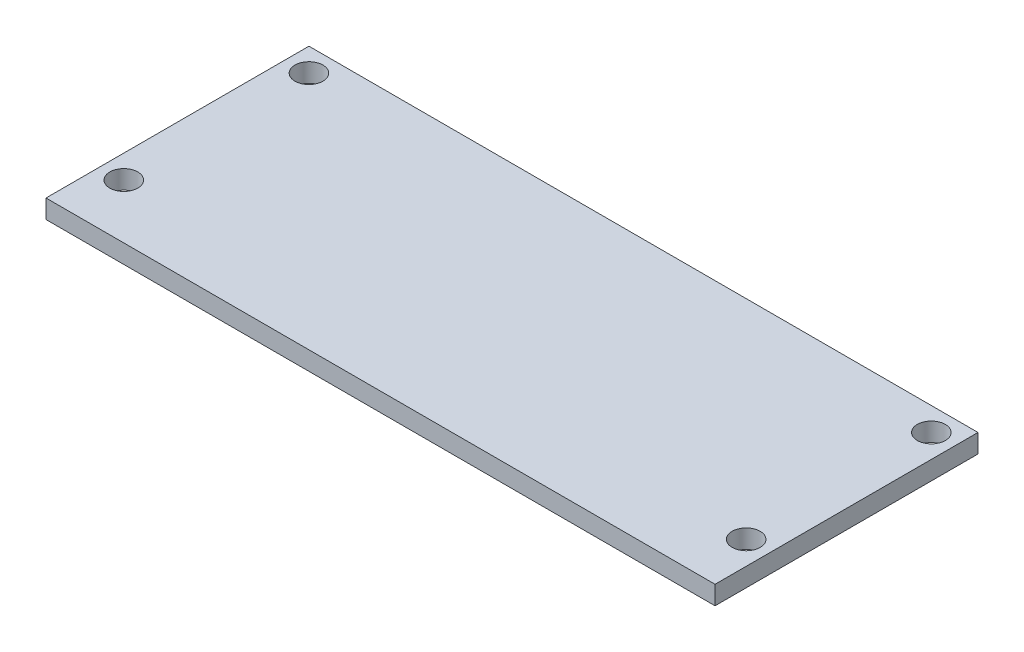
ISO-10303-21;
HEADER;
FILE_DESCRIPTION(('STEP AP214'),'2;1');
FILE_NAME('part.step','',(''),(''),'','','');
FILE_SCHEMA(('AUTOMOTIVE_DESIGN { 1 0 10303 214 1 1 1 1 }'));
ENDSEC;
DATA;
#1=APPLICATION_CONTEXT('core data for automotive mechanical design processes');
#2=APPLICATION_PROTOCOL_DEFINITION('international standard','automotive_design',2000,#1);
#3=PRODUCT_CONTEXT('',#1,'mechanical');
#4=PRODUCT('Part','Part','',(#3));
#5=PRODUCT_RELATED_PRODUCT_CATEGORY('part','',(#4));
#6=PRODUCT_DEFINITION_FORMATION('','',#4);
#7=PRODUCT_DEFINITION_CONTEXT('part definition',#1,'design');
#8=PRODUCT_DEFINITION('design','',#6,#7);
#9=PRODUCT_DEFINITION_SHAPE('','',#8);
#10=(LENGTH_UNIT() NAMED_UNIT(*) SI_UNIT(.MILLI.,.METRE.));
#11=(NAMED_UNIT(*) PLANE_ANGLE_UNIT() SI_UNIT($,.RADIAN.));
#12=(NAMED_UNIT(*) SI_UNIT($,.STERADIAN.) SOLID_ANGLE_UNIT());
#13=UNCERTAINTY_MEASURE_WITH_UNIT(LENGTH_MEASURE(1.E-05),#10,'distance_accuracy_value','');
#14=(GEOMETRIC_REPRESENTATION_CONTEXT(3) GLOBAL_UNCERTAINTY_ASSIGNED_CONTEXT((#13)) GLOBAL_UNIT_ASSIGNED_CONTEXT((#10,
#11,#12)) REPRESENTATION_CONTEXT('',''));
#15=CARTESIAN_POINT('',(0.,0.,0.));
#16=DIRECTION('',(0.,0.,1.));
#17=DIRECTION('',(1.,0.,0.));
#18=AXIS2_PLACEMENT_3D('',#15,#16,#17);
#19=CARTESIAN_POINT('',(0.,12.,0.));
#20=DIRECTION('',(0.,-1.,0.));
#21=DIRECTION('',(0.,0.,-1.));
#22=AXIS2_PLACEMENT_3D('',#19,#20,#21);
#23=PLANE('',#22);
#24=CARTESIAN_POINT('',(15.,12.,134.));
#25=DIRECTION('',(0.,1.,0.));
#26=DIRECTION('',(0.,0.,1.));
#27=AXIS2_PLACEMENT_3D('',#24,#25,#26);
#28=CIRCLE('',#27,9.);
#29=CARTESIAN_POINT('',(15.,12.,143.));
#30=VERTEX_POINT('',#29);
#31=EDGE_CURVE('E146',#30,#30,#28,.T.);
#32=ORIENTED_EDGE('',*,*,#31,.F.);
#33=EDGE_LOOP('',(#32));
#34=FACE_BOUND('',#33,.T.);
#35=CARTESIAN_POINT('',(15.,12.,15.0000000000001));
#36=DIRECTION('',(0.,1.,0.));
#37=DIRECTION('',(0.,0.,1.));
#38=AXIS2_PLACEMENT_3D('',#35,#36,#37);
#39=CIRCLE('',#38,9.00000000000001);
#40=CARTESIAN_POINT('',(15.,12.,24.0000000000001));
#41=VERTEX_POINT('',#40);
#42=EDGE_CURVE('E142',#41,#41,#39,.T.);
#43=ORIENTED_EDGE('',*,*,#42,.F.);
#44=EDGE_LOOP('',(#43));
#45=FACE_BOUND('',#44,.T.);
#46=DIRECTION('',(1.,0.,0.));
#47=VECTOR('',#46,1.);
#48=CARTESIAN_POINT('',(0.,12.,169.));
#49=LINE('',#48,#47);
#50=CARTESIAN_POINT('',(0.,12.,169.));
#51=VERTEX_POINT('',#50);
#52=CARTESIAN_POINT('',(430.,12.,169.));
#53=VERTEX_POINT('',#52);
#54=EDGE_CURVE('E104',#51,#53,#49,.T.);
#55=ORIENTED_EDGE('',*,*,#54,.T.);
#56=DIRECTION('',(0.,0.,-1.));
#57=VECTOR('',#56,1.);
#58=CARTESIAN_POINT('',(430.,12.,0.));
#59=LINE('',#58,#57);
#60=CARTESIAN_POINT('',(430.,12.,0.));
#61=VERTEX_POINT('',#60);
#62=EDGE_CURVE('E99',#53,#61,#59,.T.);
#63=ORIENTED_EDGE('',*,*,#62,.T.);
#64=DIRECTION('',(-1.,0.,0.));
#65=VECTOR('',#64,1.);
#66=CARTESIAN_POINT('',(0.,12.,0.));
#67=LINE('',#66,#65);
#68=CARTESIAN_POINT('',(0.,12.,0.));
#69=VERTEX_POINT('',#68);
#70=EDGE_CURVE('E102',#61,#69,#67,.T.);
#71=ORIENTED_EDGE('',*,*,#70,.T.);
#72=DIRECTION('',(0.,0.,1.));
#73=VECTOR('',#72,1.);
#74=CARTESIAN_POINT('',(0.,12.,169.));
#75=LINE('',#74,#73);
#76=EDGE_CURVE('E69',#69,#51,#75,.T.);
#77=ORIENTED_EDGE('',*,*,#76,.T.);
#78=EDGE_LOOP('',(#55,#63,#71,#77));
#79=FACE_BOUND('',#78,.T.);
#80=CARTESIAN_POINT('',(415.,12.,134.));
#81=DIRECTION('',(0.,-1.,0.));
#82=DIRECTION('',(0.,0.,-1.));
#83=AXIS2_PLACEMENT_3D('',#80,#81,#82);
#84=CIRCLE('',#83,9.00000000000004);
#85=CARTESIAN_POINT('',(415.,12.,125.));
#86=VERTEX_POINT('',#85);
#87=EDGE_CURVE('E162',#86,#86,#84,.T.);
#88=ORIENTED_EDGE('',*,*,#87,.T.);
#89=EDGE_LOOP('',(#88));
#90=FACE_BOUND('',#89,.T.);
#91=CARTESIAN_POINT('',(415.,12.,15.0000000000001));
#92=DIRECTION('',(0.,-1.,0.));
#93=DIRECTION('',(0.,0.,-1.));
#94=AXIS2_PLACEMENT_3D('',#91,#92,#93);
#95=CIRCLE('',#94,9.00000000000009);
#96=CARTESIAN_POINT('',(415.,12.,5.99999999999999));
#97=VERTEX_POINT('',#96);
#98=EDGE_CURVE('E154',#97,#97,#95,.T.);
#99=ORIENTED_EDGE('',*,*,#98,.T.);
#100=EDGE_LOOP('',(#99));
#101=FACE_BOUND('',#100,.T.);
#102=ADVANCED_FACE('F51',(#34,#45,#79,#90,#101),#23,.F.);
#103=CARTESIAN_POINT('',(0.,0.,0.));
#104=DIRECTION('',(0.,-1.,0.));
#105=DIRECTION('',(0.,0.,-1.));
#106=AXIS2_PLACEMENT_3D('',#103,#104,#105);
#107=PLANE('',#106);
#108=CARTESIAN_POINT('',(415.,0.,134.));
#109=DIRECTION('',(0.,-1.,0.));
#110=DIRECTION('',(0.,0.,-1.));
#111=AXIS2_PLACEMENT_3D('',#108,#109,#110);
#112=CIRCLE('',#111,9.00000000000004);
#113=CARTESIAN_POINT('',(415.,0.,125.));
#114=VERTEX_POINT('',#113);
#115=EDGE_CURVE('E158',#114,#114,#112,.T.);
#116=ORIENTED_EDGE('',*,*,#115,.F.);
#117=EDGE_LOOP('',(#116));
#118=FACE_BOUND('',#117,.T.);
#119=CARTESIAN_POINT('',(15.,0.,134.));
#120=DIRECTION('',(0.,1.,0.));
#121=DIRECTION('',(0.,0.,1.));
#122=AXIS2_PLACEMENT_3D('',#119,#120,#121);
#123=CIRCLE('',#122,9.);
#124=CARTESIAN_POINT('',(15.,0.,143.));
#125=VERTEX_POINT('',#124);
#126=EDGE_CURVE('E166',#125,#125,#123,.T.);
#127=ORIENTED_EDGE('',*,*,#126,.T.);
#128=EDGE_LOOP('',(#127));
#129=FACE_BOUND('',#128,.T.);
#130=CARTESIAN_POINT('',(15.,0.,15.0000000000001));
#131=DIRECTION('',(0.,1.,0.));
#132=DIRECTION('',(0.,0.,1.));
#133=AXIS2_PLACEMENT_3D('',#130,#131,#132);
#134=CIRCLE('',#133,9.00000000000001);
#135=CARTESIAN_POINT('',(15.,0.,24.0000000000001));
#136=VERTEX_POINT('',#135);
#137=EDGE_CURVE('E124',#136,#136,#134,.T.);
#138=ORIENTED_EDGE('',*,*,#137,.T.);
#139=EDGE_LOOP('',(#138));
#140=FACE_BOUND('',#139,.T.);
#141=DIRECTION('',(1.,0.,0.));
#142=VECTOR('',#141,1.);
#143=CARTESIAN_POINT('',(0.,0.,169.));
#144=LINE('',#143,#142);
#145=CARTESIAN_POINT('',(0.,0.,169.));
#146=VERTEX_POINT('',#145);
#147=CARTESIAN_POINT('',(430.,0.,169.));
#148=VERTEX_POINT('',#147);
#149=EDGE_CURVE('E120',#146,#148,#144,.T.);
#150=ORIENTED_EDGE('',*,*,#149,.F.);
#151=DIRECTION('',(0.,0.,1.));
#152=VECTOR('',#151,1.);
#153=CARTESIAN_POINT('',(0.,0.,169.));
#154=LINE('',#153,#152);
#155=CARTESIAN_POINT('',(0.,0.,0.));
#156=VERTEX_POINT('',#155);
#157=EDGE_CURVE('E92',#156,#146,#154,.T.);
#158=ORIENTED_EDGE('',*,*,#157,.F.);
#159=DIRECTION('',(-1.,0.,0.));
#160=VECTOR('',#159,1.);
#161=CARTESIAN_POINT('',(0.,0.,0.));
#162=LINE('',#161,#160);
#163=CARTESIAN_POINT('',(430.,0.,0.));
#164=VERTEX_POINT('',#163);
#165=EDGE_CURVE('E86',#164,#156,#162,.T.);
#166=ORIENTED_EDGE('',*,*,#165,.F.);
#167=DIRECTION('',(0.,0.,-1.));
#168=VECTOR('',#167,1.);
#169=CARTESIAN_POINT('',(430.,0.,0.));
#170=LINE('',#169,#168);
#171=EDGE_CURVE('E109',#148,#164,#170,.T.);
#172=ORIENTED_EDGE('',*,*,#171,.F.);
#173=EDGE_LOOP('',(#150,#158,#166,#172));
#174=FACE_BOUND('',#173,.T.);
#175=CARTESIAN_POINT('',(415.,0.,15.0000000000001));
#176=DIRECTION('',(0.,-1.,0.));
#177=DIRECTION('',(0.,0.,-1.));
#178=AXIS2_PLACEMENT_3D('',#175,#176,#177);
#179=CIRCLE('',#178,9.00000000000009);
#180=CARTESIAN_POINT('',(415.,0.,5.99999999999999));
#181=VERTEX_POINT('',#180);
#182=EDGE_CURVE('E150',#181,#181,#179,.T.);
#183=ORIENTED_EDGE('',*,*,#182,.F.);
#184=EDGE_LOOP('',(#183));
#185=FACE_BOUND('',#184,.T.);
#186=ADVANCED_FACE('F137',(#118,#129,#140,#174,#185),#107,.T.);
#187=CARTESIAN_POINT('',(0.,12.,169.));
#188=DIRECTION('',(0.,0.,-1.));
#189=DIRECTION('',(-1.,0.,0.));
#190=AXIS2_PLACEMENT_3D('',#187,#188,#189);
#191=PLANE('',#190);
#192=ORIENTED_EDGE('',*,*,#149,.T.);
#193=DIRECTION('',(0.,-1.,0.));
#194=VECTOR('',#193,1.);
#195=CARTESIAN_POINT('',(430.,12.,169.));
#196=LINE('',#195,#194);
#197=EDGE_CURVE('E12',#53,#148,#196,.T.);
#198=ORIENTED_EDGE('',*,*,#197,.F.);
#199=ORIENTED_EDGE('',*,*,#54,.F.);
#200=DIRECTION('',(0.,-1.,0.));
#201=VECTOR('',#200,1.);
#202=CARTESIAN_POINT('',(0.,12.,169.));
#203=LINE('',#202,#201);
#204=EDGE_CURVE('E116',#51,#146,#203,.T.);
#205=ORIENTED_EDGE('',*,*,#204,.T.);
#206=EDGE_LOOP('',(#192,#198,#199,#205));
#207=FACE_BOUND('',#206,.T.);
#208=ADVANCED_FACE('F53',(#207),#191,.F.);
#209=CARTESIAN_POINT('',(430.,12.,0.));
#210=DIRECTION('',(-1.,0.,0.));
#211=DIRECTION('',(0.,0.,1.));
#212=AXIS2_PLACEMENT_3D('',#209,#210,#211);
#213=PLANE('',#212);
#214=ORIENTED_EDGE('',*,*,#171,.T.);
#215=DIRECTION('',(0.,-1.,0.));
#216=VECTOR('',#215,1.);
#217=CARTESIAN_POINT('',(430.,12.,0.));
#218=LINE('',#217,#216);
#219=EDGE_CURVE('E61',#61,#164,#218,.T.);
#220=ORIENTED_EDGE('',*,*,#219,.F.);
#221=ORIENTED_EDGE('',*,*,#62,.F.);
#222=ORIENTED_EDGE('',*,*,#197,.T.);
#223=EDGE_LOOP('',(#214,#220,#221,#222));
#224=FACE_BOUND('',#223,.T.);
#225=ADVANCED_FACE('F108',(#224),#213,.F.);
#226=CARTESIAN_POINT('',(0.,12.,0.));
#227=DIRECTION('',(0.,0.,1.));
#228=DIRECTION('',(1.,0.,0.));
#229=AXIS2_PLACEMENT_3D('',#226,#227,#228);
#230=PLANE('',#229);
#231=ORIENTED_EDGE('',*,*,#165,.T.);
#232=DIRECTION('',(0.,-1.,0.));
#233=VECTOR('',#232,1.);
#234=CARTESIAN_POINT('',(0.,12.,0.));
#235=LINE('',#234,#233);
#236=EDGE_CURVE('E111',#69,#156,#235,.T.);
#237=ORIENTED_EDGE('',*,*,#236,.F.);
#238=ORIENTED_EDGE('',*,*,#70,.F.);
#239=ORIENTED_EDGE('',*,*,#219,.T.);
#240=EDGE_LOOP('',(#231,#237,#238,#239));
#241=FACE_BOUND('',#240,.T.);
#242=ADVANCED_FACE('F112',(#241),#230,.F.);
#243=CARTESIAN_POINT('',(0.,12.,169.));
#244=DIRECTION('',(1.,0.,0.));
#245=DIRECTION('',(0.,0.,-1.));
#246=AXIS2_PLACEMENT_3D('',#243,#244,#245);
#247=PLANE('',#246);
#248=ORIENTED_EDGE('',*,*,#157,.T.);
#249=ORIENTED_EDGE('',*,*,#204,.F.);
#250=ORIENTED_EDGE('',*,*,#76,.F.);
#251=ORIENTED_EDGE('',*,*,#236,.T.);
#252=EDGE_LOOP('',(#248,#249,#250,#251));
#253=FACE_BOUND('',#252,.T.);
#254=ADVANCED_FACE('F134',(#253),#247,.F.);
#255=CARTESIAN_POINT('',(15.,0.,15.0000000000001));
#256=DIRECTION('',(0.,1.,0.));
#257=DIRECTION('',(0.,0.,1.));
#258=AXIS2_PLACEMENT_3D('',#255,#256,#257);
#259=CYLINDRICAL_SURFACE('',#258,9.00000000000001);
#260=ORIENTED_EDGE('',*,*,#137,.F.);
#261=EDGE_LOOP('',(#260));
#262=FACE_BOUND('',#261,.T.);
#263=ORIENTED_EDGE('',*,*,#42,.T.);
#264=EDGE_LOOP('',(#263));
#265=FACE_BOUND('',#264,.T.);
#266=ADVANCED_FACE('F181',(#262,#265),#259,.F.);
#267=CARTESIAN_POINT('',(15.,0.,134.));
#268=DIRECTION('',(0.,1.,0.));
#269=DIRECTION('',(0.,0.,1.));
#270=AXIS2_PLACEMENT_3D('',#267,#268,#269);
#271=CYLINDRICAL_SURFACE('',#270,9.);
#272=ORIENTED_EDGE('',*,*,#126,.F.);
#273=EDGE_LOOP('',(#272));
#274=FACE_BOUND('',#273,.T.);
#275=ORIENTED_EDGE('',*,*,#31,.T.);
#276=EDGE_LOOP('',(#275));
#277=FACE_BOUND('',#276,.T.);
#278=ADVANCED_FACE('F174',(#274,#277),#271,.F.);
#279=CARTESIAN_POINT('',(415.,0.,134.));
#280=DIRECTION('',(0.,1.,0.));
#281=DIRECTION('',(0.,0.,1.));
#282=AXIS2_PLACEMENT_3D('',#279,#280,#281);
#283=CYLINDRICAL_SURFACE('',#282,9.00000000000004);
#284=ORIENTED_EDGE('',*,*,#115,.T.);
#285=EDGE_LOOP('',(#284));
#286=FACE_BOUND('',#285,.T.);
#287=ORIENTED_EDGE('',*,*,#87,.F.);
#288=EDGE_LOOP('',(#287));
#289=FACE_BOUND('',#288,.T.);
#290=ADVANCED_FACE('F189',(#286,#289),#283,.F.);
#291=CARTESIAN_POINT('',(415.,0.,15.0000000000001));
#292=DIRECTION('',(0.,1.,0.));
#293=DIRECTION('',(0.,0.,1.));
#294=AXIS2_PLACEMENT_3D('',#291,#292,#293);
#295=CYLINDRICAL_SURFACE('',#294,9.00000000000009);
#296=ORIENTED_EDGE('',*,*,#182,.T.);
#297=EDGE_LOOP('',(#296));
#298=FACE_BOUND('',#297,.T.);
#299=ORIENTED_EDGE('',*,*,#98,.F.);
#300=EDGE_LOOP('',(#299));
#301=FACE_BOUND('',#300,.T.);
#302=ADVANCED_FACE('F196',(#298,#301),#295,.F.);
#303=CLOSED_SHELL('',(#102,#186,#208,#225,#242,#254,#266,#278,#290,#302));
#304=MANIFOLD_SOLID_BREP('B2',#303);
#305=ADVANCED_BREP_SHAPE_REPRESENTATION('',(#18,#304),#14);
#306=SHAPE_DEFINITION_REPRESENTATION(#9,#305);
ENDSEC;
END-ISO-10303-21;
